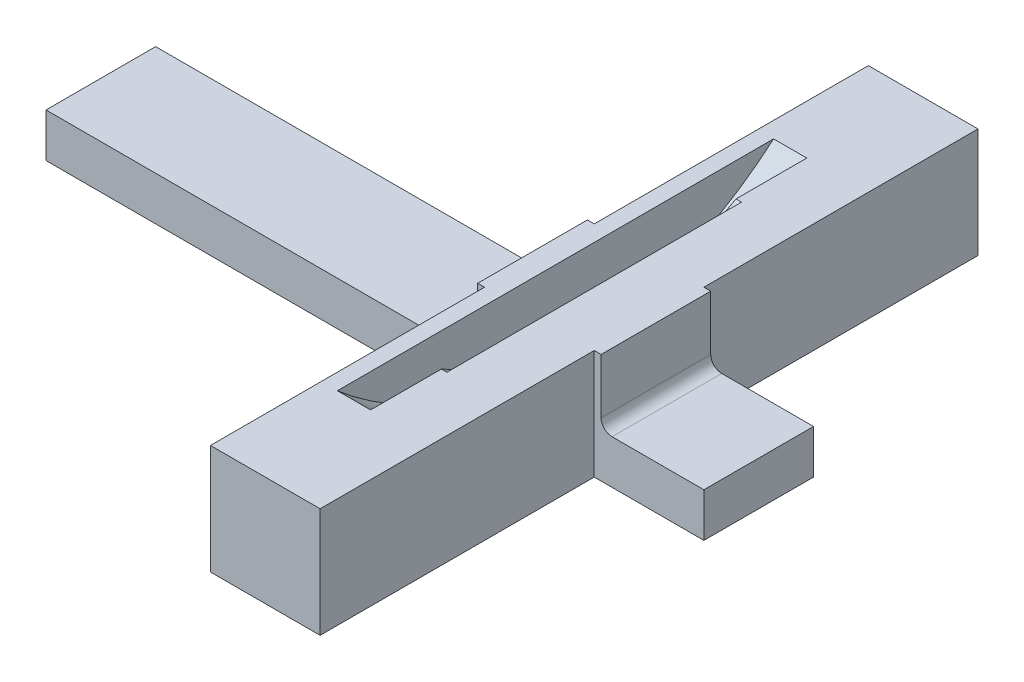
ISO-10303-21;
HEADER;
FILE_DESCRIPTION(('STEP AP214'),'2;1');
FILE_NAME('part.step','',(''),(''),'','','');
FILE_SCHEMA(('AUTOMOTIVE_DESIGN { 1 0 10303 214 1 1 1 1 }'));
ENDSEC;
DATA;
#1=APPLICATION_CONTEXT('core data for automotive mechanical design processes');
#2=APPLICATION_PROTOCOL_DEFINITION('international standard','automotive_design',2000,#1);
#3=PRODUCT_CONTEXT('',#1,'mechanical');
#4=PRODUCT('Part','Part','',(#3));
#5=PRODUCT_RELATED_PRODUCT_CATEGORY('part','',(#4));
#6=PRODUCT_DEFINITION_FORMATION('','',#4);
#7=PRODUCT_DEFINITION_CONTEXT('part definition',#1,'design');
#8=PRODUCT_DEFINITION('design','',#6,#7);
#9=PRODUCT_DEFINITION_SHAPE('','',#8);
#10=(LENGTH_UNIT() NAMED_UNIT(*) SI_UNIT(.MILLI.,.METRE.));
#11=(NAMED_UNIT(*) PLANE_ANGLE_UNIT() SI_UNIT($,.RADIAN.));
#12=(NAMED_UNIT(*) SI_UNIT($,.STERADIAN.) SOLID_ANGLE_UNIT());
#13=UNCERTAINTY_MEASURE_WITH_UNIT(LENGTH_MEASURE(1.E-05),#10,'distance_accuracy_value','');
#14=(GEOMETRIC_REPRESENTATION_CONTEXT(3) GLOBAL_UNCERTAINTY_ASSIGNED_CONTEXT((#13)) GLOBAL_UNIT_ASSIGNED_CONTEXT((#10,
#11,#12)) REPRESENTATION_CONTEXT('',''));
#15=CARTESIAN_POINT('',(0.,0.,0.));
#16=DIRECTION('',(0.,0.,1.));
#17=DIRECTION('',(1.,0.,0.));
#18=AXIS2_PLACEMENT_3D('',#15,#16,#17);
#19=CARTESIAN_POINT('',(0.,25.4,12.7));
#20=DIRECTION('',(0.,0.,-1.));
#21=DIRECTION('',(-1.,0.,0.));
#22=AXIS2_PLACEMENT_3D('',#19,#20,#21);
#23=PLANE('',#22);
#24=CARTESIAN_POINT('',(97.4725,12.7,12.7));
#25=DIRECTION('',(0.,0.,-1.));
#26=DIRECTION('',(-1.,0.,0.));
#27=AXIS2_PLACEMENT_3D('',#24,#25,#26);
#28=CIRCLE('',#27,2.54);
#29=CARTESIAN_POINT('',(100.0125,12.7,12.7));
#30=VERTEX_POINT('',#29);
#31=CARTESIAN_POINT('',(97.4725,10.16,12.7));
#32=VERTEX_POINT('',#31);
#33=EDGE_CURVE('E413',#30,#32,#28,.T.);
#34=ORIENTED_EDGE('',*,*,#33,.T.);
#35=DIRECTION('',(-1.,0.,0.));
#36=VECTOR('',#35,1.);
#37=CARTESIAN_POINT('',(0.,10.16,12.7));
#38=LINE('',#37,#36);
#39=CARTESIAN_POINT('',(0.,10.16,12.7));
#40=VERTEX_POINT('',#39);
#41=EDGE_CURVE('E417',#32,#40,#38,.T.);
#42=ORIENTED_EDGE('',*,*,#41,.T.);
#43=DIRECTION('',(0.,-1.,0.));
#44=VECTOR('',#43,1.);
#45=CARTESIAN_POINT('',(0.,25.4,12.7));
#46=LINE('',#45,#44);
#47=CARTESIAN_POINT('',(0.,0.,12.7));
#48=VERTEX_POINT('',#47);
#49=EDGE_CURVE('E330',#40,#48,#46,.T.);
#50=ORIENTED_EDGE('',*,*,#49,.T.);
#51=DIRECTION('',(1.,0.,0.));
#52=VECTOR('',#51,1.);
#53=CARTESIAN_POINT('',(0.,0.,12.7));
#54=LINE('',#53,#52);
#55=CARTESIAN_POINT('',(101.6,0.,12.7));
#56=VERTEX_POINT('',#55);
#57=EDGE_CURVE('E302',#48,#56,#54,.T.);
#58=ORIENTED_EDGE('',*,*,#57,.T.);
#59=DIRECTION('',(0.,-1.,0.));
#60=VECTOR('',#59,1.);
#61=CARTESIAN_POINT('',(101.6,25.4,12.7));
#62=LINE('',#61,#60);
#63=CARTESIAN_POINT('',(101.6,25.4,12.7));
#64=VERTEX_POINT('',#63);
#65=EDGE_CURVE('E226',#64,#56,#62,.T.);
#66=ORIENTED_EDGE('',*,*,#65,.F.);
#67=DIRECTION('',(1.,0.,0.));
#68=VECTOR('',#67,1.);
#69=CARTESIAN_POINT('',(0.,25.4,12.7));
#70=LINE('',#69,#68);
#71=CARTESIAN_POINT('',(100.0125,25.4,12.7));
#72=VERTEX_POINT('',#71);
#73=EDGE_CURVE('E303',#72,#64,#70,.T.);
#74=ORIENTED_EDGE('',*,*,#73,.F.);
#75=DIRECTION('',(0.,-1.,0.));
#76=VECTOR('',#75,1.);
#77=CARTESIAN_POINT('',(100.0125,25.4,12.7));
#78=LINE('',#77,#76);
#79=EDGE_CURVE('E56',#72,#30,#78,.T.);
#80=ORIENTED_EDGE('',*,*,#79,.T.);
#81=EDGE_LOOP('',(#34,#42,#50,#58,#66,#74,#80));
#82=FACE_BOUND('',#81,.T.);
#83=ADVANCED_FACE('F41',(#82),#23,.F.);
#84=CARTESIAN_POINT('',(101.6,25.4,0.));
#85=DIRECTION('',(1.,0.,0.));
#86=DIRECTION('',(0.,0.,-1.));
#87=AXIS2_PLACEMENT_3D('',#84,#85,#86);
#88=PLANE('',#87);
#89=DIRECTION('',(0.,0.,1.));
#90=VECTOR('',#89,1.);
#91=CARTESIAN_POINT('',(101.6,0.,0.));
#92=LINE('',#91,#90);
#93=CARTESIAN_POINT('',(101.6,0.,76.2));
#94=VERTEX_POINT('',#93);
#95=EDGE_CURVE('E333',#56,#94,#92,.T.);
#96=ORIENTED_EDGE('',*,*,#95,.T.);
#97=DIRECTION('',(0.,-1.,0.));
#98=VECTOR('',#97,1.);
#99=CARTESIAN_POINT('',(101.6,25.4,76.2));
#100=LINE('',#99,#98);
#101=CARTESIAN_POINT('',(101.6,25.4,76.2));
#102=VERTEX_POINT('',#101);
#103=EDGE_CURVE('E224',#102,#94,#100,.T.);
#104=ORIENTED_EDGE('',*,*,#103,.F.);
#105=DIRECTION('',(0.,0.,1.));
#106=VECTOR('',#105,1.);
#107=CARTESIAN_POINT('',(101.6,25.4,0.));
#108=LINE('',#107,#106);
#109=EDGE_CURVE('E305',#64,#102,#108,.T.);
#110=ORIENTED_EDGE('',*,*,#109,.F.);
#111=ORIENTED_EDGE('',*,*,#65,.T.);
#112=EDGE_LOOP('',(#96,#104,#110,#111));
#113=FACE_BOUND('',#112,.T.);
#114=ADVANCED_FACE('F448',(#113),#88,.F.);
#115=CARTESIAN_POINT('',(0.,25.4,76.2));
#116=DIRECTION('',(0.,0.,1.));
#117=DIRECTION('',(1.,0.,0.));
#118=AXIS2_PLACEMENT_3D('',#115,#116,#117);
#119=PLANE('',#118);
#120=DIRECTION('',(-1.,0.,0.));
#121=VECTOR('',#120,1.);
#122=CARTESIAN_POINT('',(0.,0.,76.2));
#123=LINE('',#122,#121);
#124=CARTESIAN_POINT('',(127.,0.,76.2));
#125=VERTEX_POINT('',#124);
#126=EDGE_CURVE('E336',#125,#94,#123,.T.);
#127=ORIENTED_EDGE('',*,*,#126,.F.);
#128=DIRECTION('',(0.,-1.,0.));
#129=VECTOR('',#128,1.);
#130=CARTESIAN_POINT('',(127.,25.4,76.2));
#131=LINE('',#130,#129);
#132=CARTESIAN_POINT('',(127.,25.4,76.2));
#133=VERTEX_POINT('',#132);
#134=EDGE_CURVE('E217',#133,#125,#131,.T.);
#135=ORIENTED_EDGE('',*,*,#134,.F.);
#136=DIRECTION('',(-1.,0.,0.));
#137=VECTOR('',#136,1.);
#138=CARTESIAN_POINT('',(0.,25.4,76.2));
#139=LINE('',#138,#137);
#140=EDGE_CURVE('E308',#133,#102,#139,.T.);
#141=ORIENTED_EDGE('',*,*,#140,.T.);
#142=ORIENTED_EDGE('',*,*,#103,.T.);
#143=EDGE_LOOP('',(#127,#135,#141,#142));
#144=FACE_BOUND('',#143,.T.);
#145=ADVANCED_FACE('F451',(#144),#119,.T.);
#146=CARTESIAN_POINT('',(127.,25.4,0.));
#147=DIRECTION('',(1.,0.,0.));
#148=DIRECTION('',(0.,0.,-1.));
#149=AXIS2_PLACEMENT_3D('',#146,#147,#148);
#150=PLANE('',#149);
#151=DIRECTION('',(0.,0.,1.));
#152=VECTOR('',#151,1.);
#153=CARTESIAN_POINT('',(127.,0.,0.));
#154=LINE('',#153,#152);
#155=CARTESIAN_POINT('',(127.,0.,12.7));
#156=VERTEX_POINT('',#155);
#157=EDGE_CURVE('E339',#156,#125,#154,.T.);
#158=ORIENTED_EDGE('',*,*,#157,.F.);
#159=DIRECTION('',(0.,-1.,0.));
#160=VECTOR('',#159,1.);
#161=CARTESIAN_POINT('',(127.,25.4,12.7));
#162=LINE('',#161,#160);
#163=CARTESIAN_POINT('',(127.,25.4,12.7));
#164=VERTEX_POINT('',#163);
#165=EDGE_CURVE('E215',#164,#156,#162,.T.);
#166=ORIENTED_EDGE('',*,*,#165,.F.);
#167=DIRECTION('',(0.,0.,1.));
#168=VECTOR('',#167,1.);
#169=CARTESIAN_POINT('',(127.,25.4,0.));
#170=LINE('',#169,#168);
#171=EDGE_CURVE('E311',#164,#133,#170,.T.);
#172=ORIENTED_EDGE('',*,*,#171,.T.);
#173=ORIENTED_EDGE('',*,*,#134,.T.);
#174=EDGE_LOOP('',(#158,#166,#172,#173));
#175=FACE_BOUND('',#174,.T.);
#176=ADVANCED_FACE('F455',(#175),#150,.T.);
#177=CARTESIAN_POINT('',(0.,25.4,12.7));
#178=DIRECTION('',(0.,0.,-1.));
#179=DIRECTION('',(-1.,0.,0.));
#180=AXIS2_PLACEMENT_3D('',#177,#178,#179);
#181=PLANE('',#180);
#182=CARTESIAN_POINT('',(131.1275,12.7,12.7));
#183=DIRECTION('',(0.,0.,-1.));
#184=DIRECTION('',(-1.,0.,0.));
#185=AXIS2_PLACEMENT_3D('',#182,#183,#184);
#186=CIRCLE('',#185,2.53999999999999);
#187=CARTESIAN_POINT('',(131.1275,10.16,12.7));
#188=VERTEX_POINT('',#187);
#189=CARTESIAN_POINT('',(128.5875,12.7,12.7));
#190=VERTEX_POINT('',#189);
#191=EDGE_CURVE('E200',#188,#190,#186,.T.);
#192=ORIENTED_EDGE('',*,*,#191,.T.);
#193=DIRECTION('',(0.,-1.,0.));
#194=VECTOR('',#193,1.);
#195=CARTESIAN_POINT('',(128.5875,25.4,12.7));
#196=LINE('',#195,#194);
#197=CARTESIAN_POINT('',(128.5875,25.4,12.7));
#198=VERTEX_POINT('',#197);
#199=EDGE_CURVE('E296',#198,#190,#196,.T.);
#200=ORIENTED_EDGE('',*,*,#199,.F.);
#201=DIRECTION('',(1.,0.,0.));
#202=VECTOR('',#201,1.);
#203=CARTESIAN_POINT('',(0.,25.4,12.7));
#204=LINE('',#203,#202);
#205=EDGE_CURVE('E314',#164,#198,#204,.T.);
#206=ORIENTED_EDGE('',*,*,#205,.F.);
#207=ORIENTED_EDGE('',*,*,#165,.T.);
#208=DIRECTION('',(1.,0.,0.));
#209=VECTOR('',#208,1.);
#210=CARTESIAN_POINT('',(0.,0.,12.7));
#211=LINE('',#210,#209);
#212=CARTESIAN_POINT('',(152.4,0.,12.7));
#213=VERTEX_POINT('',#212);
#214=EDGE_CURVE('E213',#156,#213,#211,.T.);
#215=ORIENTED_EDGE('',*,*,#214,.T.);
#216=DIRECTION('',(0.,-1.,0.));
#217=VECTOR('',#216,1.);
#218=CARTESIAN_POINT('',(152.4,25.4,12.7));
#219=LINE('',#218,#217);
#220=CARTESIAN_POINT('',(152.4,10.16,12.7));
#221=VERTEX_POINT('',#220);
#222=EDGE_CURVE('E207',#221,#213,#219,.T.);
#223=ORIENTED_EDGE('',*,*,#222,.F.);
#224=DIRECTION('',(-1.,0.,0.));
#225=VECTOR('',#224,1.);
#226=CARTESIAN_POINT('',(152.4,10.16,12.7));
#227=LINE('',#226,#225);
#228=EDGE_CURVE('E189',#221,#188,#227,.T.);
#229=ORIENTED_EDGE('',*,*,#228,.T.);
#230=EDGE_LOOP('',(#192,#200,#206,#207,#215,#223,#229));
#231=FACE_BOUND('',#230,.T.);
#232=ADVANCED_FACE('F211',(#231),#181,.F.);
#233=CARTESIAN_POINT('',(152.4,25.4,0.));
#234=DIRECTION('',(-1.,0.,0.));
#235=DIRECTION('',(0.,0.,1.));
#236=AXIS2_PLACEMENT_3D('',#233,#234,#235);
#237=PLANE('',#236);
#238=DIRECTION('',(0.,-1.,0.));
#239=VECTOR('',#238,1.);
#240=CARTESIAN_POINT('',(152.4,25.4,-12.7));
#241=LINE('',#240,#239);
#242=CARTESIAN_POINT('',(152.4,10.16,-12.7));
#243=VERTEX_POINT('',#242);
#244=CARTESIAN_POINT('',(152.4,0.,-12.7));
#245=VERTEX_POINT('',#244);
#246=EDGE_CURVE('E209',#243,#245,#241,.T.);
#247=ORIENTED_EDGE('',*,*,#246,.F.);
#248=DIRECTION('',(0.,0.,-1.));
#249=VECTOR('',#248,1.);
#250=CARTESIAN_POINT('',(152.4,10.16,12.7));
#251=LINE('',#250,#249);
#252=EDGE_CURVE('E193',#221,#243,#251,.T.);
#253=ORIENTED_EDGE('',*,*,#252,.F.);
#254=ORIENTED_EDGE('',*,*,#222,.T.);
#255=DIRECTION('',(0.,0.,-1.));
#256=VECTOR('',#255,1.);
#257=CARTESIAN_POINT('',(152.4,0.,0.));
#258=LINE('',#257,#256);
#259=EDGE_CURVE('E343',#213,#245,#258,.T.);
#260=ORIENTED_EDGE('',*,*,#259,.T.);
#261=EDGE_LOOP('',(#247,#253,#254,#260));
#262=FACE_BOUND('',#261,.T.);
#263=ADVANCED_FACE('F205',(#262),#237,.F.);
#264=CARTESIAN_POINT('',(0.,25.4,-12.7));
#265=DIRECTION('',(0.,0.,-1.));
#266=DIRECTION('',(-1.,0.,0.));
#267=AXIS2_PLACEMENT_3D('',#264,#265,#266);
#268=PLANE('',#267);
#269=DIRECTION('',(0.,-1.,0.));
#270=VECTOR('',#269,1.);
#271=CARTESIAN_POINT('',(128.5875,25.4,-12.7));
#272=LINE('',#271,#270);
#273=CARTESIAN_POINT('',(128.5875,25.4,-12.7));
#274=VERTEX_POINT('',#273);
#275=CARTESIAN_POINT('',(128.5875,12.7,-12.7));
#276=VERTEX_POINT('',#275);
#277=EDGE_CURVE('E297',#274,#276,#272,.T.);
#278=ORIENTED_EDGE('',*,*,#277,.T.);
#279=CARTESIAN_POINT('',(131.1275,12.7,-12.7));
#280=DIRECTION('',(0.,0.,-1.));
#281=DIRECTION('',(-1.,0.,0.));
#282=AXIS2_PLACEMENT_3D('',#279,#280,#281);
#283=CIRCLE('',#282,2.53999999999999);
#284=CARTESIAN_POINT('',(131.1275,10.16,-12.7));
#285=VERTEX_POINT('',#284);
#286=EDGE_CURVE('E201',#285,#276,#283,.T.);
#287=ORIENTED_EDGE('',*,*,#286,.F.);
#288=DIRECTION('',(-1.,0.,0.));
#289=VECTOR('',#288,1.);
#290=CARTESIAN_POINT('',(152.4,10.16,-12.7));
#291=LINE('',#290,#289);
#292=EDGE_CURVE('E406',#243,#285,#291,.T.);
#293=ORIENTED_EDGE('',*,*,#292,.F.);
#294=ORIENTED_EDGE('',*,*,#246,.T.);
#295=DIRECTION('',(1.,0.,0.));
#296=VECTOR('',#295,1.);
#297=CARTESIAN_POINT('',(0.,0.,-12.7));
#298=LINE('',#297,#296);
#299=CARTESIAN_POINT('',(127.,0.,-12.7));
#300=VERTEX_POINT('',#299);
#301=EDGE_CURVE('E345',#300,#245,#298,.T.);
#302=ORIENTED_EDGE('',*,*,#301,.F.);
#303=DIRECTION('',(0.,-1.,0.));
#304=VECTOR('',#303,1.);
#305=CARTESIAN_POINT('',(127.,25.4,-12.7));
#306=LINE('',#305,#304);
#307=CARTESIAN_POINT('',(127.,25.4,-12.7));
#308=VERTEX_POINT('',#307);
#309=EDGE_CURVE('E219',#308,#300,#306,.T.);
#310=ORIENTED_EDGE('',*,*,#309,.F.);
#311=DIRECTION('',(1.,0.,0.));
#312=VECTOR('',#311,1.);
#313=CARTESIAN_POINT('',(0.,25.4,-12.7));
#314=LINE('',#313,#312);
#315=EDGE_CURVE('E317',#308,#274,#314,.T.);
#316=ORIENTED_EDGE('',*,*,#315,.T.);
#317=EDGE_LOOP('',(#278,#287,#293,#294,#302,#310,#316));
#318=FACE_BOUND('',#317,.T.);
#319=ADVANCED_FACE('F377',(#318),#268,.T.);
#320=CARTESIAN_POINT('',(127.,25.4,0.));
#321=DIRECTION('',(1.,0.,0.));
#322=DIRECTION('',(0.,0.,-1.));
#323=AXIS2_PLACEMENT_3D('',#320,#321,#322);
#324=PLANE('',#323);
#325=DIRECTION('',(0.,0.,1.));
#326=VECTOR('',#325,1.);
#327=CARTESIAN_POINT('',(127.,0.,0.));
#328=LINE('',#327,#326);
#329=CARTESIAN_POINT('',(127.,0.,-76.2));
#330=VERTEX_POINT('',#329);
#331=EDGE_CURVE('E348',#330,#300,#328,.T.);
#332=ORIENTED_EDGE('',*,*,#331,.F.);
#333=DIRECTION('',(0.,-1.,0.));
#334=VECTOR('',#333,1.);
#335=CARTESIAN_POINT('',(127.,25.4,-76.2));
#336=LINE('',#335,#334);
#337=CARTESIAN_POINT('',(127.,25.4,-76.2));
#338=VERTEX_POINT('',#337);
#339=EDGE_CURVE('E369',#338,#330,#336,.T.);
#340=ORIENTED_EDGE('',*,*,#339,.F.);
#341=DIRECTION('',(0.,0.,1.));
#342=VECTOR('',#341,1.);
#343=CARTESIAN_POINT('',(127.,25.4,0.));
#344=LINE('',#343,#342);
#345=EDGE_CURVE('E320',#338,#308,#344,.T.);
#346=ORIENTED_EDGE('',*,*,#345,.T.);
#347=ORIENTED_EDGE('',*,*,#309,.T.);
#348=EDGE_LOOP('',(#332,#340,#346,#347));
#349=FACE_BOUND('',#348,.T.);
#350=ADVANCED_FACE('F373',(#349),#324,.T.);
#351=CARTESIAN_POINT('',(0.,25.4,-76.2));
#352=DIRECTION('',(0.,0.,1.));
#353=DIRECTION('',(1.,0.,0.));
#354=AXIS2_PLACEMENT_3D('',#351,#352,#353);
#355=PLANE('',#354);
#356=DIRECTION('',(-1.,0.,0.));
#357=VECTOR('',#356,1.);
#358=CARTESIAN_POINT('',(0.,0.,-76.2));
#359=LINE('',#358,#357);
#360=CARTESIAN_POINT('',(101.6,0.,-76.2));
#361=VERTEX_POINT('',#360);
#362=EDGE_CURVE('E351',#330,#361,#359,.T.);
#363=ORIENTED_EDGE('',*,*,#362,.T.);
#364=DIRECTION('',(0.,-1.,0.));
#365=VECTOR('',#364,1.);
#366=CARTESIAN_POINT('',(101.6,25.4,-76.2));
#367=LINE('',#366,#365);
#368=CARTESIAN_POINT('',(101.6,25.4,-76.2));
#369=VERTEX_POINT('',#368);
#370=EDGE_CURVE('E366',#369,#361,#367,.T.);
#371=ORIENTED_EDGE('',*,*,#370,.F.);
#372=DIRECTION('',(-1.,0.,0.));
#373=VECTOR('',#372,1.);
#374=CARTESIAN_POINT('',(0.,25.4,-76.2));
#375=LINE('',#374,#373);
#376=EDGE_CURVE('E323',#338,#369,#375,.T.);
#377=ORIENTED_EDGE('',*,*,#376,.F.);
#378=ORIENTED_EDGE('',*,*,#339,.T.);
#379=EDGE_LOOP('',(#363,#371,#377,#378));
#380=FACE_BOUND('',#379,.T.);
#381=ADVANCED_FACE('F385',(#380),#355,.F.);
#382=CARTESIAN_POINT('',(101.6,25.4,0.));
#383=DIRECTION('',(1.,0.,0.));
#384=DIRECTION('',(0.,0.,-1.));
#385=AXIS2_PLACEMENT_3D('',#382,#383,#384);
#386=PLANE('',#385);
#387=DIRECTION('',(0.,0.,1.));
#388=VECTOR('',#387,1.);
#389=CARTESIAN_POINT('',(101.6,0.,0.));
#390=LINE('',#389,#388);
#391=CARTESIAN_POINT('',(101.6,0.,-12.7));
#392=VERTEX_POINT('',#391);
#393=EDGE_CURVE('E353',#361,#392,#390,.T.);
#394=ORIENTED_EDGE('',*,*,#393,.T.);
#395=DIRECTION('',(0.,-1.,0.));
#396=VECTOR('',#395,1.);
#397=CARTESIAN_POINT('',(101.6,25.4,-12.7));
#398=LINE('',#397,#396);
#399=CARTESIAN_POINT('',(101.6,25.4,-12.7));
#400=VERTEX_POINT('',#399);
#401=EDGE_CURVE('E364',#400,#392,#398,.T.);
#402=ORIENTED_EDGE('',*,*,#401,.F.);
#403=DIRECTION('',(0.,0.,1.));
#404=VECTOR('',#403,1.);
#405=CARTESIAN_POINT('',(101.6,25.4,0.));
#406=LINE('',#405,#404);
#407=EDGE_CURVE('E325',#369,#400,#406,.T.);
#408=ORIENTED_EDGE('',*,*,#407,.F.);
#409=ORIENTED_EDGE('',*,*,#370,.T.);
#410=EDGE_LOOP('',(#394,#402,#408,#409));
#411=FACE_BOUND('',#410,.T.);
#412=ADVANCED_FACE('F389',(#411),#386,.F.);
#413=CARTESIAN_POINT('',(0.,25.4,-12.7));
#414=DIRECTION('',(0.,0.,-1.));
#415=DIRECTION('',(-1.,0.,0.));
#416=AXIS2_PLACEMENT_3D('',#413,#414,#415);
#417=PLANE('',#416);
#418=DIRECTION('',(-1.,0.,0.));
#419=VECTOR('',#418,1.);
#420=CARTESIAN_POINT('',(0.,10.16,-12.7));
#421=LINE('',#420,#419);
#422=CARTESIAN_POINT('',(97.4725,10.16,-12.7));
#423=VERTEX_POINT('',#422);
#424=CARTESIAN_POINT('',(0.,10.16,-12.7));
#425=VERTEX_POINT('',#424);
#426=EDGE_CURVE('E414',#423,#425,#421,.T.);
#427=ORIENTED_EDGE('',*,*,#426,.F.);
#428=CARTESIAN_POINT('',(97.4725,12.7,-12.7));
#429=DIRECTION('',(0.,0.,-1.));
#430=DIRECTION('',(-1.,0.,0.));
#431=AXIS2_PLACEMENT_3D('',#428,#429,#430);
#432=CIRCLE('',#431,2.54);
#433=CARTESIAN_POINT('',(100.0125,12.7,-12.7));
#434=VERTEX_POINT('',#433);
#435=EDGE_CURVE('E422',#434,#423,#432,.T.);
#436=ORIENTED_EDGE('',*,*,#435,.F.);
#437=DIRECTION('',(0.,-1.,0.));
#438=VECTOR('',#437,1.);
#439=CARTESIAN_POINT('',(100.0125,25.4,-12.7));
#440=LINE('',#439,#438);
#441=CARTESIAN_POINT('',(100.0125,25.4,-12.7));
#442=VERTEX_POINT('',#441);
#443=EDGE_CURVE('E403',#442,#434,#440,.T.);
#444=ORIENTED_EDGE('',*,*,#443,.F.);
#445=DIRECTION('',(1.,0.,0.));
#446=VECTOR('',#445,1.);
#447=CARTESIAN_POINT('',(0.,25.4,-12.7));
#448=LINE('',#447,#446);
#449=EDGE_CURVE('E328',#442,#400,#448,.T.);
#450=ORIENTED_EDGE('',*,*,#449,.T.);
#451=ORIENTED_EDGE('',*,*,#401,.T.);
#452=DIRECTION('',(1.,0.,0.));
#453=VECTOR('',#452,1.);
#454=CARTESIAN_POINT('',(0.,0.,-12.7));
#455=LINE('',#454,#453);
#456=CARTESIAN_POINT('',(0.,0.,-12.7));
#457=VERTEX_POINT('',#456);
#458=EDGE_CURVE('E356',#457,#392,#455,.T.);
#459=ORIENTED_EDGE('',*,*,#458,.F.);
#460=DIRECTION('',(0.,-1.,0.));
#461=VECTOR('',#460,1.);
#462=CARTESIAN_POINT('',(0.,25.4,-12.7));
#463=LINE('',#462,#461);
#464=EDGE_CURVE('E362',#425,#457,#463,.T.);
#465=ORIENTED_EDGE('',*,*,#464,.F.);
#466=EDGE_LOOP('',(#427,#436,#444,#450,#451,#459,#465));
#467=FACE_BOUND('',#466,.T.);
#468=ADVANCED_FACE('F435',(#467),#417,.T.);
#469=CARTESIAN_POINT('',(0.,25.4,0.));
#470=DIRECTION('',(-1.,0.,0.));
#471=DIRECTION('',(0.,0.,1.));
#472=AXIS2_PLACEMENT_3D('',#469,#470,#471);
#473=PLANE('',#472);
#474=DIRECTION('',(0.,0.,-1.));
#475=VECTOR('',#474,1.);
#476=CARTESIAN_POINT('',(0.,10.16,12.7));
#477=LINE('',#476,#475);
#478=EDGE_CURVE('E272',#40,#425,#477,.T.);
#479=ORIENTED_EDGE('',*,*,#478,.T.);
#480=ORIENTED_EDGE('',*,*,#464,.T.);
#481=DIRECTION('',(0.,0.,-1.));
#482=VECTOR('',#481,1.);
#483=CARTESIAN_POINT('',(0.,0.,0.));
#484=LINE('',#483,#482);
#485=EDGE_CURVE('E306',#48,#457,#484,.T.);
#486=ORIENTED_EDGE('',*,*,#485,.F.);
#487=ORIENTED_EDGE('',*,*,#49,.F.);
#488=EDGE_LOOP('',(#479,#480,#486,#487));
#489=FACE_BOUND('',#488,.T.);
#490=ADVANCED_FACE('F459',(#489),#473,.T.);
#491=CARTESIAN_POINT('',(0.,25.4,0.));
#492=DIRECTION('',(0.,1.,0.));
#493=DIRECTION('',(0.,0.,1.));
#494=AXIS2_PLACEMENT_3D('',#491,#492,#493);
#495=PLANE('',#494);
#496=DIRECTION('',(0.,0.,-1.));
#497=VECTOR('',#496,1.);
#498=CARTESIAN_POINT('',(100.0125,25.4,12.7));
#499=LINE('',#498,#497);
#500=EDGE_CURVE('E280',#72,#442,#499,.T.);
#501=ORIENTED_EDGE('',*,*,#500,.F.);
#502=ORIENTED_EDGE('',*,*,#73,.T.);
#503=ORIENTED_EDGE('',*,*,#109,.T.);
#504=ORIENTED_EDGE('',*,*,#140,.F.);
#505=ORIENTED_EDGE('',*,*,#171,.F.);
#506=ORIENTED_EDGE('',*,*,#205,.T.);
#507=DIRECTION('',(0.,0.,1.));
#508=VECTOR('',#507,1.);
#509=CARTESIAN_POINT('',(128.5875,25.4,-12.7));
#510=LINE('',#509,#508);
#511=EDGE_CURVE('E299',#274,#198,#510,.T.);
#512=ORIENTED_EDGE('',*,*,#511,.F.);
#513=ORIENTED_EDGE('',*,*,#315,.F.);
#514=ORIENTED_EDGE('',*,*,#345,.F.);
#515=ORIENTED_EDGE('',*,*,#376,.T.);
#516=ORIENTED_EDGE('',*,*,#407,.T.);
#517=ORIENTED_EDGE('',*,*,#449,.F.);
#518=EDGE_LOOP('',(#501,#502,#503,#504,#505,#506,#512,#513,#514,#515,#516,#517));
#519=FACE_BOUND('',#518,.T.);
#520=DIRECTION('',(-1.,0.,0.));
#521=VECTOR('',#520,1.);
#522=CARTESIAN_POINT('',(113.0173,25.4,50.5290053088323));
#523=LINE('',#522,#521);
#524=CARTESIAN_POINT('',(113.0173,25.4,50.5290053088323));
#525=VERTEX_POINT('',#524);
#526=CARTESIAN_POINT('',(105.3211,25.4,50.5290053088323));
#527=VERTEX_POINT('',#526);
#528=EDGE_CURVE('E251',#525,#527,#523,.T.);
#529=ORIENTED_EDGE('',*,*,#528,.T.);
#530=DIRECTION('',(0.,0.,-1.));
#531=VECTOR('',#530,1.);
#532=CARTESIAN_POINT('',(105.3211,25.4,0.));
#533=LINE('',#532,#531);
#534=CARTESIAN_POINT('',(105.3211,25.4,-50.5290053088323));
#535=VERTEX_POINT('',#534);
#536=EDGE_CURVE('E11',#527,#535,#533,.T.);
#537=ORIENTED_EDGE('',*,*,#536,.T.);
#538=DIRECTION('',(-1.,0.,0.));
#539=VECTOR('',#538,1.);
#540=CARTESIAN_POINT('',(113.0173,25.4,-50.5290053088323));
#541=LINE('',#540,#539);
#542=CARTESIAN_POINT('',(113.0173,25.4,-50.5290053088323));
#543=VERTEX_POINT('',#542);
#544=EDGE_CURVE('E44',#535,#543,#541,.F.);
#545=ORIENTED_EDGE('',*,*,#544,.T.);
#546=DIRECTION('',(0.,0.,-1.));
#547=VECTOR('',#546,1.);
#548=CARTESIAN_POINT('',(113.0173,25.4,0.));
#549=LINE('',#548,#547);
#550=CARTESIAN_POINT('',(113.0173,25.4,-34.13125));
#551=VERTEX_POINT('',#550);
#552=EDGE_CURVE('E249',#551,#543,#549,.T.);
#553=ORIENTED_EDGE('',*,*,#552,.F.);
#554=DIRECTION('',(-1.,0.,0.));
#555=VECTOR('',#554,1.);
#556=CARTESIAN_POINT('',(114.3,25.4,-34.13125));
#557=LINE('',#556,#555);
#558=CARTESIAN_POINT('',(114.3,25.4,-34.13125));
#559=VERTEX_POINT('',#558);
#560=EDGE_CURVE('E246',#551,#559,#557,.F.);
#561=ORIENTED_EDGE('',*,*,#560,.T.);
#562=DIRECTION('',(0.,0.,-1.));
#563=VECTOR('',#562,1.);
#564=CARTESIAN_POINT('',(114.3,25.4,0.));
#565=LINE('',#564,#563);
#566=CARTESIAN_POINT('',(114.3,25.4,34.13125));
#567=VERTEX_POINT('',#566);
#568=EDGE_CURVE('E240',#567,#559,#565,.T.);
#569=ORIENTED_EDGE('',*,*,#568,.F.);
#570=DIRECTION('',(-1.,0.,0.));
#571=VECTOR('',#570,1.);
#572=CARTESIAN_POINT('',(114.3,25.4,34.13125));
#573=LINE('',#572,#571);
#574=CARTESIAN_POINT('',(113.0173,25.4,34.13125));
#575=VERTEX_POINT('',#574);
#576=EDGE_CURVE('E243',#567,#575,#573,.T.);
#577=ORIENTED_EDGE('',*,*,#576,.T.);
#578=EDGE_CURVE('E250',#525,#575,#549,.T.);
#579=ORIENTED_EDGE('',*,*,#578,.F.);
#580=EDGE_LOOP('',(#529,#537,#545,#553,#561,#569,#577,#579));
#581=FACE_BOUND('',#580,.T.);
#582=ADVANCED_FACE('F270',(#519,#581),#495,.T.);
#583=CARTESIAN_POINT('',(0.,0.,0.));
#584=DIRECTION('',(0.,1.,0.));
#585=DIRECTION('',(0.,0.,1.));
#586=AXIS2_PLACEMENT_3D('',#583,#584,#585);
#587=PLANE('',#586);
#588=CARTESIAN_POINT('',(114.3,0.,-50.8));
#589=DIRECTION('',(0.,1.,0.));
#590=DIRECTION('',(0.,0.,1.));
#591=AXIS2_PLACEMENT_3D('',#588,#589,#590);
#592=CIRCLE('',#591,3.04799999999998);
#593=CARTESIAN_POINT('',(114.3,0.,-47.752));
#594=VERTEX_POINT('',#593);
#595=EDGE_CURVE('E238',#594,#594,#592,.F.);
#596=ORIENTED_EDGE('',*,*,#595,.F.);
#597=EDGE_LOOP('',(#596));
#598=FACE_BOUND('',#597,.T.);
#599=CARTESIAN_POINT('',(139.7,0.,0.));
#600=DIRECTION('',(0.,1.,0.));
#601=DIRECTION('',(0.,0.,1.));
#602=AXIS2_PLACEMENT_3D('',#599,#600,#601);
#603=CIRCLE('',#602,3.04799999999998);
#604=CARTESIAN_POINT('',(139.7,0.,3.04799999999998));
#605=VERTEX_POINT('',#604);
#606=EDGE_CURVE('E235',#605,#605,#603,.F.);
#607=ORIENTED_EDGE('',*,*,#606,.F.);
#608=EDGE_LOOP('',(#607));
#609=FACE_BOUND('',#608,.T.);
#610=CARTESIAN_POINT('',(114.3,0.,50.8));
#611=DIRECTION('',(0.,1.,0.));
#612=DIRECTION('',(0.,0.,1.));
#613=AXIS2_PLACEMENT_3D('',#610,#611,#612);
#614=CIRCLE('',#613,3.04799999999998);
#615=CARTESIAN_POINT('',(114.3,0.,53.848));
#616=VERTEX_POINT('',#615);
#617=EDGE_CURVE('E232',#616,#616,#614,.F.);
#618=ORIENTED_EDGE('',*,*,#617,.F.);
#619=EDGE_LOOP('',(#618));
#620=FACE_BOUND('',#619,.T.);
#621=CARTESIAN_POINT('',(25.4,0.,0.));
#622=DIRECTION('',(0.,1.,0.));
#623=DIRECTION('',(0.,0.,1.));
#624=AXIS2_PLACEMENT_3D('',#621,#622,#623);
#625=CIRCLE('',#624,3.048);
#626=CARTESIAN_POINT('',(25.4,0.,3.048));
#627=VERTEX_POINT('',#626);
#628=EDGE_CURVE('E229',#627,#627,#625,.F.);
#629=ORIENTED_EDGE('',*,*,#628,.F.);
#630=EDGE_LOOP('',(#629));
#631=FACE_BOUND('',#630,.T.);
#632=ORIENTED_EDGE('',*,*,#57,.F.);
#633=ORIENTED_EDGE('',*,*,#485,.T.);
#634=ORIENTED_EDGE('',*,*,#458,.T.);
#635=ORIENTED_EDGE('',*,*,#393,.F.);
#636=ORIENTED_EDGE('',*,*,#362,.F.);
#637=ORIENTED_EDGE('',*,*,#331,.T.);
#638=ORIENTED_EDGE('',*,*,#301,.T.);
#639=ORIENTED_EDGE('',*,*,#259,.F.);
#640=ORIENTED_EDGE('',*,*,#214,.F.);
#641=ORIENTED_EDGE('',*,*,#157,.T.);
#642=ORIENTED_EDGE('',*,*,#126,.T.);
#643=ORIENTED_EDGE('',*,*,#95,.F.);
#644=EDGE_LOOP('',(#632,#633,#634,#635,#636,#637,#638,#639,#640,#641,#642,#643));
#645=FACE_BOUND('',#644,.T.);
#646=ADVANCED_FACE('F381',(#598,#609,#620,#631,#645),#587,.F.);
#647=CARTESIAN_POINT('',(128.5875,25.4,-12.7));
#648=DIRECTION('',(-1.,0.,0.));
#649=DIRECTION('',(0.,0.,1.));
#650=AXIS2_PLACEMENT_3D('',#647,#648,#649);
#651=PLANE('',#650);
#652=ORIENTED_EDGE('',*,*,#199,.T.);
#653=DIRECTION('',(0.,0.,-1.));
#654=VECTOR('',#653,1.);
#655=CARTESIAN_POINT('',(128.5875,12.7,12.7));
#656=LINE('',#655,#654);
#657=EDGE_CURVE('E399',#190,#276,#656,.T.);
#658=ORIENTED_EDGE('',*,*,#657,.T.);
#659=ORIENTED_EDGE('',*,*,#277,.F.);
#660=ORIENTED_EDGE('',*,*,#511,.T.);
#661=EDGE_LOOP('',(#652,#658,#659,#660));
#662=FACE_BOUND('',#661,.T.);
#663=ADVANCED_FACE('F400',(#662),#651,.F.);
#664=CARTESIAN_POINT('',(25.4,-6.35,0.));
#665=DIRECTION('',(0.,1.,0.));
#666=DIRECTION('',(0.,0.,1.));
#667=AXIS2_PLACEMENT_3D('',#664,#665,#666);
#668=CYLINDRICAL_SURFACE('',#667,3.048);
#669=CARTESIAN_POINT('',(25.4,-6.35,0.));
#670=DIRECTION('',(0.,-1.,0.));
#671=DIRECTION('',(0.,0.,-1.));
#672=AXIS2_PLACEMENT_3D('',#669,#670,#671);
#673=CIRCLE('',#672,3.048);
#674=CARTESIAN_POINT('',(25.4,-6.35,-3.048));
#675=VERTEX_POINT('',#674);
#676=EDGE_CURVE('E293',#675,#675,#673,.T.);
#677=ORIENTED_EDGE('',*,*,#676,.F.);
#678=EDGE_LOOP('',(#677));
#679=FACE_BOUND('',#678,.T.);
#680=ORIENTED_EDGE('',*,*,#628,.T.);
#681=EDGE_LOOP('',(#680));
#682=FACE_BOUND('',#681,.T.);
#683=ADVANCED_FACE('F526',(#679,#682),#668,.T.);
#684=CARTESIAN_POINT('',(25.4,-6.35,0.));
#685=DIRECTION('',(0.,-1.,0.));
#686=DIRECTION('',(0.,0.,-1.));
#687=AXIS2_PLACEMENT_3D('',#684,#685,#686);
#688=PLANE('',#687);
#689=ORIENTED_EDGE('',*,*,#676,.T.);
#690=EDGE_LOOP('',(#689));
#691=FACE_BOUND('',#690,.T.);
#692=ADVANCED_FACE('F611',(#691),#688,.T.);
#693=CARTESIAN_POINT('',(114.3,-6.35,50.8));
#694=DIRECTION('',(0.,1.,0.));
#695=DIRECTION('',(0.,0.,1.));
#696=AXIS2_PLACEMENT_3D('',#693,#694,#695);
#697=CYLINDRICAL_SURFACE('',#696,3.04799999999998);
#698=CARTESIAN_POINT('',(114.3,-6.35,50.8));
#699=DIRECTION('',(0.,-1.,0.));
#700=DIRECTION('',(0.,0.,-1.));
#701=AXIS2_PLACEMENT_3D('',#698,#699,#700);
#702=CIRCLE('',#701,3.04799999999998);
#703=CARTESIAN_POINT('',(114.3,-6.35,47.752));
#704=VERTEX_POINT('',#703);
#705=EDGE_CURVE('E290',#704,#704,#702,.T.);
#706=ORIENTED_EDGE('',*,*,#705,.F.);
#707=EDGE_LOOP('',(#706));
#708=FACE_BOUND('',#707,.T.);
#709=ORIENTED_EDGE('',*,*,#617,.T.);
#710=EDGE_LOOP('',(#709));
#711=FACE_BOUND('',#710,.T.);
#712=ADVANCED_FACE('F607',(#708,#711),#697,.T.);
#713=CARTESIAN_POINT('',(114.3,-6.35,50.8));
#714=DIRECTION('',(0.,-1.,0.));
#715=DIRECTION('',(0.,0.,-1.));
#716=AXIS2_PLACEMENT_3D('',#713,#714,#715);
#717=PLANE('',#716);
#718=ORIENTED_EDGE('',*,*,#705,.T.);
#719=EDGE_LOOP('',(#718));
#720=FACE_BOUND('',#719,.T.);
#721=ADVANCED_FACE('F603',(#720),#717,.T.);
#722=CARTESIAN_POINT('',(139.7,-6.35,0.));
#723=DIRECTION('',(0.,1.,0.));
#724=DIRECTION('',(0.,0.,1.));
#725=AXIS2_PLACEMENT_3D('',#722,#723,#724);
#726=CYLINDRICAL_SURFACE('',#725,3.04799999999998);
#727=CARTESIAN_POINT('',(139.7,-6.35,0.));
#728=DIRECTION('',(0.,-1.,0.));
#729=DIRECTION('',(0.,0.,-1.));
#730=AXIS2_PLACEMENT_3D('',#727,#728,#729);
#731=CIRCLE('',#730,3.04799999999998);
#732=CARTESIAN_POINT('',(139.7,-6.35,-3.04799999999998));
#733=VERTEX_POINT('',#732);
#734=EDGE_CURVE('E287',#733,#733,#731,.T.);
#735=ORIENTED_EDGE('',*,*,#734,.F.);
#736=EDGE_LOOP('',(#735));
#737=FACE_BOUND('',#736,.T.);
#738=ORIENTED_EDGE('',*,*,#606,.T.);
#739=EDGE_LOOP('',(#738));
#740=FACE_BOUND('',#739,.T.);
#741=ADVANCED_FACE('F599',(#737,#740),#726,.T.);
#742=CARTESIAN_POINT('',(139.7,-6.35,0.));
#743=DIRECTION('',(0.,-1.,0.));
#744=DIRECTION('',(0.,0.,-1.));
#745=AXIS2_PLACEMENT_3D('',#742,#743,#744);
#746=PLANE('',#745);
#747=ORIENTED_EDGE('',*,*,#734,.T.);
#748=EDGE_LOOP('',(#747));
#749=FACE_BOUND('',#748,.T.);
#750=ADVANCED_FACE('F595',(#749),#746,.T.);
#751=CARTESIAN_POINT('',(114.3,-6.35,-50.8));
#752=DIRECTION('',(0.,1.,0.));
#753=DIRECTION('',(0.,0.,1.));
#754=AXIS2_PLACEMENT_3D('',#751,#752,#753);
#755=CYLINDRICAL_SURFACE('',#754,3.04799999999998);
#756=CARTESIAN_POINT('',(114.3,-6.35,-50.8));
#757=DIRECTION('',(0.,-1.,0.));
#758=DIRECTION('',(0.,0.,-1.));
#759=AXIS2_PLACEMENT_3D('',#756,#757,#758);
#760=CIRCLE('',#759,3.04799999999998);
#761=CARTESIAN_POINT('',(114.3,-6.35,-53.848));
#762=VERTEX_POINT('',#761);
#763=EDGE_CURVE('E283',#762,#762,#760,.T.);
#764=ORIENTED_EDGE('',*,*,#763,.F.);
#765=EDGE_LOOP('',(#764));
#766=FACE_BOUND('',#765,.T.);
#767=ORIENTED_EDGE('',*,*,#595,.T.);
#768=EDGE_LOOP('',(#767));
#769=FACE_BOUND('',#768,.T.);
#770=ADVANCED_FACE('F591',(#766,#769),#755,.T.);
#771=CARTESIAN_POINT('',(114.3,-6.35,-50.8));
#772=DIRECTION('',(0.,-1.,0.));
#773=DIRECTION('',(0.,0.,-1.));
#774=AXIS2_PLACEMENT_3D('',#771,#772,#773);
#775=PLANE('',#774);
#776=ORIENTED_EDGE('',*,*,#763,.T.);
#777=EDGE_LOOP('',(#776));
#778=FACE_BOUND('',#777,.T.);
#779=ADVANCED_FACE('F587',(#778),#775,.T.);
#780=CARTESIAN_POINT('',(113.0173,83.4514346635809,0.));
#781=DIRECTION('',(-1.,0.,0.));
#782=DIRECTION('',(0.,0.,1.));
#783=AXIS2_PLACEMENT_3D('',#780,#781,#782);
#784=CYLINDRICAL_SURFACE('',#783,76.962);
#785=CARTESIAN_POINT('',(105.3211,83.4514346635809,0.));
#786=DIRECTION('',(1.,0.,0.));
#787=DIRECTION('',(0.,0.,-1.));
#788=AXIS2_PLACEMENT_3D('',#785,#786,#787);
#789=CIRCLE('',#788,76.962);
#790=EDGE_CURVE('E268',#527,#535,#789,.T.);
#791=ORIENTED_EDGE('',*,*,#790,.F.);
#792=ORIENTED_EDGE('',*,*,#528,.F.);
#793=CARTESIAN_POINT('',(113.0173,83.4514346635809,0.));
#794=DIRECTION('',(1.,0.,0.));
#795=DIRECTION('',(0.,0.,-1.));
#796=AXIS2_PLACEMENT_3D('',#793,#794,#795);
#797=CIRCLE('',#796,76.962);
#798=EDGE_CURVE('E264',#525,#543,#797,.T.);
#799=ORIENTED_EDGE('',*,*,#798,.T.);
#800=ORIENTED_EDGE('',*,*,#544,.F.);
#801=EDGE_LOOP('',(#791,#792,#799,#800));
#802=FACE_BOUND('',#801,.T.);
#803=ADVANCED_FACE('F581',(#802),#784,.F.);
#804=CARTESIAN_POINT('',(113.0173,83.4514346635809,0.));
#805=DIRECTION('',(1.,0.,0.));
#806=DIRECTION('',(0.,0.,-1.));
#807=AXIS2_PLACEMENT_3D('',#804,#805,#806);
#808=PLANE('',#807);
#809=ORIENTED_EDGE('',*,*,#578,.T.);
#810=CARTESIAN_POINT('',(113.0173,83.4514346635809,0.));
#811=DIRECTION('',(1.,0.,0.));
#812=DIRECTION('',(0.,0.,-1.));
#813=AXIS2_PLACEMENT_3D('',#810,#811,#812);
#814=CIRCLE('',#813,67.34175);
#815=EDGE_CURVE('E261',#575,#551,#814,.T.);
#816=ORIENTED_EDGE('',*,*,#815,.T.);
#817=ORIENTED_EDGE('',*,*,#552,.T.);
#818=ORIENTED_EDGE('',*,*,#798,.F.);
#819=EDGE_LOOP('',(#809,#816,#817,#818));
#820=FACE_BOUND('',#819,.T.);
#821=ADVANCED_FACE('F260',(#820),#808,.F.);
#822=CARTESIAN_POINT('',(105.3211,83.4514346635809,0.));
#823=DIRECTION('',(1.,0.,0.));
#824=DIRECTION('',(0.,0.,-1.));
#825=AXIS2_PLACEMENT_3D('',#822,#823,#824);
#826=PLANE('',#825);
#827=ORIENTED_EDGE('',*,*,#790,.T.);
#828=ORIENTED_EDGE('',*,*,#536,.F.);
#829=EDGE_LOOP('',(#827,#828));
#830=FACE_BOUND('',#829,.T.);
#831=ADVANCED_FACE('F578',(#830),#826,.T.);
#832=CARTESIAN_POINT('',(114.3,83.4514346635809,0.));
#833=DIRECTION('',(-1.,0.,0.));
#834=DIRECTION('',(0.,0.,1.));
#835=AXIS2_PLACEMENT_3D('',#832,#833,#834);
#836=CYLINDRICAL_SURFACE('',#835,67.34175);
#837=ORIENTED_EDGE('',*,*,#815,.F.);
#838=ORIENTED_EDGE('',*,*,#576,.F.);
#839=CARTESIAN_POINT('',(114.3,83.4514346635809,0.));
#840=DIRECTION('',(1.,0.,0.));
#841=DIRECTION('',(0.,0.,-1.));
#842=AXIS2_PLACEMENT_3D('',#839,#840,#841);
#843=CIRCLE('',#842,67.34175);
#844=EDGE_CURVE('E63',#567,#559,#843,.T.);
#845=ORIENTED_EDGE('',*,*,#844,.T.);
#846=ORIENTED_EDGE('',*,*,#560,.F.);
#847=EDGE_LOOP('',(#837,#838,#845,#846));
#848=FACE_BOUND('',#847,.T.);
#849=ADVANCED_FACE('F266',(#848),#836,.F.);
#850=CARTESIAN_POINT('',(114.3,83.4514346635809,0.));
#851=DIRECTION('',(1.,0.,0.));
#852=DIRECTION('',(0.,0.,-1.));
#853=AXIS2_PLACEMENT_3D('',#850,#851,#852);
#854=PLANE('',#853);
#855=ORIENTED_EDGE('',*,*,#568,.T.);
#856=ORIENTED_EDGE('',*,*,#844,.F.);
#857=EDGE_LOOP('',(#855,#856));
#858=FACE_BOUND('',#857,.T.);
#859=ADVANCED_FACE('F271',(#858),#854,.F.);
#860=CARTESIAN_POINT('',(0.,10.16,12.7));
#861=DIRECTION('',(0.,-1.,0.));
#862=DIRECTION('',(1.,0.,0.));
#863=AXIS2_PLACEMENT_3D('',#860,#861,#862);
#864=PLANE('',#863);
#865=ORIENTED_EDGE('',*,*,#426,.T.);
#866=ORIENTED_EDGE('',*,*,#478,.F.);
#867=ORIENTED_EDGE('',*,*,#41,.F.);
#868=DIRECTION('',(0.,0.,-1.));
#869=VECTOR('',#868,1.);
#870=CARTESIAN_POINT('',(97.4725,10.16,12.7));
#871=LINE('',#870,#869);
#872=EDGE_CURVE('E277',#32,#423,#871,.T.);
#873=ORIENTED_EDGE('',*,*,#872,.T.);
#874=EDGE_LOOP('',(#865,#866,#867,#873));
#875=FACE_BOUND('',#874,.T.);
#876=ADVANCED_FACE('F440',(#875),#864,.F.);
#877=CARTESIAN_POINT('',(97.4725,12.7,12.7));
#878=DIRECTION('',(0.,0.,-1.));
#879=DIRECTION('',(-1.,0.,0.));
#880=AXIS2_PLACEMENT_3D('',#877,#878,#879);
#881=CYLINDRICAL_SURFACE('',#880,2.54);
#882=ORIENTED_EDGE('',*,*,#435,.T.);
#883=ORIENTED_EDGE('',*,*,#872,.F.);
#884=ORIENTED_EDGE('',*,*,#33,.F.);
#885=DIRECTION('',(0.,0.,-1.));
#886=VECTOR('',#885,1.);
#887=CARTESIAN_POINT('',(100.0125,12.7,12.7));
#888=LINE('',#887,#886);
#889=EDGE_CURVE('E426',#30,#434,#888,.T.);
#890=ORIENTED_EDGE('',*,*,#889,.T.);
#891=EDGE_LOOP('',(#882,#883,#884,#890));
#892=FACE_BOUND('',#891,.T.);
#893=ADVANCED_FACE('F437',(#892),#881,.F.);
#894=CARTESIAN_POINT('',(100.0125,25.4,12.7));
#895=DIRECTION('',(1.,0.,0.));
#896=DIRECTION('',(0.,0.,-1.));
#897=AXIS2_PLACEMENT_3D('',#894,#895,#896);
#898=PLANE('',#897);
#899=ORIENTED_EDGE('',*,*,#443,.T.);
#900=ORIENTED_EDGE('',*,*,#889,.F.);
#901=ORIENTED_EDGE('',*,*,#79,.F.);
#902=ORIENTED_EDGE('',*,*,#500,.T.);
#903=EDGE_LOOP('',(#899,#900,#901,#902));
#904=FACE_BOUND('',#903,.T.);
#905=ADVANCED_FACE('F430',(#904),#898,.F.);
#906=CARTESIAN_POINT('',(131.1275,12.7,12.7));
#907=DIRECTION('',(0.,0.,-1.));
#908=DIRECTION('',(-1.,0.,0.));
#909=AXIS2_PLACEMENT_3D('',#906,#907,#908);
#910=CYLINDRICAL_SURFACE('',#909,2.53999999999999);
#911=ORIENTED_EDGE('',*,*,#286,.T.);
#912=ORIENTED_EDGE('',*,*,#657,.F.);
#913=ORIENTED_EDGE('',*,*,#191,.F.);
#914=DIRECTION('',(0.,0.,-1.));
#915=VECTOR('',#914,1.);
#916=CARTESIAN_POINT('',(131.1275,10.16,12.7));
#917=LINE('',#916,#915);
#918=EDGE_CURVE('E195',#188,#285,#917,.T.);
#919=ORIENTED_EDGE('',*,*,#918,.T.);
#920=EDGE_LOOP('',(#911,#912,#913,#919));
#921=FACE_BOUND('',#920,.T.);
#922=ADVANCED_FACE('F405',(#921),#910,.F.);
#923=CARTESIAN_POINT('',(152.4,10.16,12.7));
#924=DIRECTION('',(0.,-1.,0.));
#925=DIRECTION('',(1.,0.,0.));
#926=AXIS2_PLACEMENT_3D('',#923,#924,#925);
#927=PLANE('',#926);
#928=ORIENTED_EDGE('',*,*,#292,.T.);
#929=ORIENTED_EDGE('',*,*,#918,.F.);
#930=ORIENTED_EDGE('',*,*,#228,.F.);
#931=ORIENTED_EDGE('',*,*,#252,.T.);
#932=EDGE_LOOP('',(#928,#929,#930,#931));
#933=FACE_BOUND('',#932,.T.);
#934=ADVANCED_FACE('F192',(#933),#927,.F.);
#935=CLOSED_SHELL('',(#83,#114,#145,#176,#232,#263,#319,#350,#381,#412,#468,#490,#582,#646,#663,
#683,#692,#712,#721,#741,#750,#770,#779,#803,#821,#831,#849,#859,#876,#893,#905,#922,#934));
#936=MANIFOLD_SOLID_BREP('B2',#935);
#937=ADVANCED_BREP_SHAPE_REPRESENTATION('',(#18,#936),#14);
#938=SHAPE_DEFINITION_REPRESENTATION(#9,#937);
ENDSEC;
END-ISO-10303-21;
